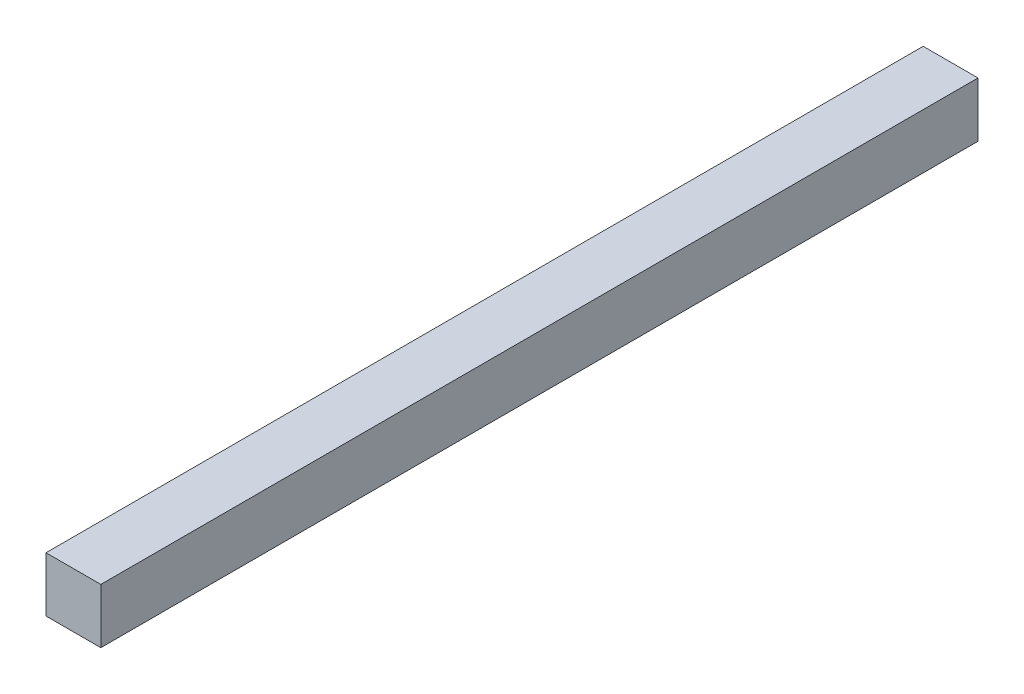
ISO-10303-21;
HEADER;
FILE_DESCRIPTION(('STEP AP214'),'2;1');
FILE_NAME('part.step','',(''),(''),'','','');
FILE_SCHEMA(('AUTOMOTIVE_DESIGN { 1 0 10303 214 1 1 1 1 }'));
ENDSEC;
DATA;
#1=APPLICATION_CONTEXT('core data for automotive mechanical design processes');
#2=APPLICATION_PROTOCOL_DEFINITION('international standard','automotive_design',2000,#1);
#3=PRODUCT_CONTEXT('',#1,'mechanical');
#4=PRODUCT('Part','Part','',(#3));
#5=PRODUCT_RELATED_PRODUCT_CATEGORY('part','',(#4));
#6=PRODUCT_DEFINITION_FORMATION('','',#4);
#7=PRODUCT_DEFINITION_CONTEXT('part definition',#1,'design');
#8=PRODUCT_DEFINITION('design','',#6,#7);
#9=PRODUCT_DEFINITION_SHAPE('','',#8);
#10=(LENGTH_UNIT() NAMED_UNIT(*) SI_UNIT(.MILLI.,.METRE.));
#11=(NAMED_UNIT(*) PLANE_ANGLE_UNIT() SI_UNIT($,.RADIAN.));
#12=(NAMED_UNIT(*) SI_UNIT($,.STERADIAN.) SOLID_ANGLE_UNIT());
#13=UNCERTAINTY_MEASURE_WITH_UNIT(LENGTH_MEASURE(1.E-05),#10,'distance_accuracy_value','');
#14=(GEOMETRIC_REPRESENTATION_CONTEXT(3) GLOBAL_UNCERTAINTY_ASSIGNED_CONTEXT((#13)) GLOBAL_UNIT_ASSIGNED_CONTEXT((#10,
#11,#12)) REPRESENTATION_CONTEXT('',''));
#15=CARTESIAN_POINT('',(0.,0.,0.));
#16=DIRECTION('',(0.,0.,1.));
#17=DIRECTION('',(1.,0.,0.));
#18=AXIS2_PLACEMENT_3D('',#15,#16,#17);
#19=CARTESIAN_POINT('',(-12.7,12.7,406.4));
#20=DIRECTION('',(1.,0.,0.));
#21=DIRECTION('',(0.,1.,0.));
#22=AXIS2_PLACEMENT_3D('',#19,#20,#21);
#23=PLANE('',#22);
#24=DIRECTION('',(0.,-1.,0.));
#25=VECTOR('',#24,1.);
#26=CARTESIAN_POINT('',(-12.7,12.7,0.));
#27=LINE('',#26,#25);
#28=CARTESIAN_POINT('',(-12.7,12.7,0.));
#29=VERTEX_POINT('',#28);
#30=CARTESIAN_POINT('',(-12.7,-12.7,0.));
#31=VERTEX_POINT('',#30);
#32=EDGE_CURVE('E107',#29,#31,#27,.T.);
#33=ORIENTED_EDGE('',*,*,#32,.T.);
#34=DIRECTION('',(0.,0.,-1.));
#35=VECTOR('',#34,1.);
#36=CARTESIAN_POINT('',(-12.7,-12.7,406.4));
#37=LINE('',#36,#35);
#38=CARTESIAN_POINT('',(-12.7,-12.7,406.4));
#39=VERTEX_POINT('',#38);
#40=EDGE_CURVE('E11',#39,#31,#37,.T.);
#41=ORIENTED_EDGE('',*,*,#40,.F.);
#42=DIRECTION('',(0.,-1.,0.));
#43=VECTOR('',#42,1.);
#44=CARTESIAN_POINT('',(-12.7,12.7,406.4));
#45=LINE('',#44,#43);
#46=CARTESIAN_POINT('',(-12.7,12.7,406.4));
#47=VERTEX_POINT('',#46);
#48=EDGE_CURVE('E89',#47,#39,#45,.T.);
#49=ORIENTED_EDGE('',*,*,#48,.F.);
#50=DIRECTION('',(0.,0.,-1.));
#51=VECTOR('',#50,1.);
#52=CARTESIAN_POINT('',(-12.7,12.7,406.4));
#53=LINE('',#52,#51);
#54=EDGE_CURVE('E56',#47,#29,#53,.T.);
#55=ORIENTED_EDGE('',*,*,#54,.T.);
#56=EDGE_LOOP('',(#33,#41,#49,#55));
#57=FACE_BOUND('',#56,.T.);
#58=ADVANCED_FACE('F39',(#57),#23,.F.);
#59=CARTESIAN_POINT('',(-12.7,-12.7,406.4));
#60=DIRECTION('',(0.,1.,0.));
#61=DIRECTION('',(0.,0.,1.));
#62=AXIS2_PLACEMENT_3D('',#59,#60,#61);
#63=PLANE('',#62);
#64=DIRECTION('',(1.,0.,0.));
#65=VECTOR('',#64,1.);
#66=CARTESIAN_POINT('',(-12.7,-12.7,0.));
#67=LINE('',#66,#65);
#68=CARTESIAN_POINT('',(12.7,-12.7,0.));
#69=VERTEX_POINT('',#68);
#70=EDGE_CURVE('E95',#31,#69,#67,.T.);
#71=ORIENTED_EDGE('',*,*,#70,.T.);
#72=DIRECTION('',(0.,0.,-1.));
#73=VECTOR('',#72,1.);
#74=CARTESIAN_POINT('',(12.7,-12.7,406.4));
#75=LINE('',#74,#73);
#76=CARTESIAN_POINT('',(12.7,-12.7,406.4));
#77=VERTEX_POINT('',#76);
#78=EDGE_CURVE('E48',#77,#69,#75,.T.);
#79=ORIENTED_EDGE('',*,*,#78,.F.);
#80=DIRECTION('',(1.,0.,0.));
#81=VECTOR('',#80,1.);
#82=CARTESIAN_POINT('',(-12.7,-12.7,406.4));
#83=LINE('',#82,#81);
#84=EDGE_CURVE('E81',#39,#77,#83,.T.);
#85=ORIENTED_EDGE('',*,*,#84,.F.);
#86=ORIENTED_EDGE('',*,*,#40,.T.);
#87=EDGE_LOOP('',(#71,#79,#85,#86));
#88=FACE_BOUND('',#87,.T.);
#89=ADVANCED_FACE('F94',(#88),#63,.F.);
#90=CARTESIAN_POINT('',(12.7,12.7,406.4));
#91=DIRECTION('',(1.,0.,0.));
#92=DIRECTION('',(0.,1.,0.));
#93=AXIS2_PLACEMENT_3D('',#90,#91,#92);
#94=PLANE('',#93);
#95=DIRECTION('',(0.,-1.,0.));
#96=VECTOR('',#95,1.);
#97=CARTESIAN_POINT('',(12.7,12.7,0.));
#98=LINE('',#97,#96);
#99=CARTESIAN_POINT('',(12.7,12.7,0.));
#100=VERTEX_POINT('',#99);
#101=EDGE_CURVE('E112',#100,#69,#98,.T.);
#102=ORIENTED_EDGE('',*,*,#101,.F.);
#103=DIRECTION('',(0.,0.,-1.));
#104=VECTOR('',#103,1.);
#105=CARTESIAN_POINT('',(12.7,12.7,406.4));
#106=LINE('',#105,#104);
#107=CARTESIAN_POINT('',(12.7,12.7,406.4));
#108=VERTEX_POINT('',#107);
#109=EDGE_CURVE('E70',#108,#100,#106,.T.);
#110=ORIENTED_EDGE('',*,*,#109,.F.);
#111=DIRECTION('',(0.,-1.,0.));
#112=VECTOR('',#111,1.);
#113=CARTESIAN_POINT('',(12.7,12.7,406.4));
#114=LINE('',#113,#112);
#115=EDGE_CURVE('E88',#108,#77,#114,.T.);
#116=ORIENTED_EDGE('',*,*,#115,.T.);
#117=ORIENTED_EDGE('',*,*,#78,.T.);
#118=EDGE_LOOP('',(#102,#110,#116,#117));
#119=FACE_BOUND('',#118,.T.);
#120=ADVANCED_FACE('F99',(#119),#94,.T.);
#121=CARTESIAN_POINT('',(-12.7,12.7,406.4));
#122=DIRECTION('',(0.,1.,0.));
#123=DIRECTION('',(0.,0.,1.));
#124=AXIS2_PLACEMENT_3D('',#121,#122,#123);
#125=PLANE('',#124);
#126=DIRECTION('',(1.,0.,0.));
#127=VECTOR('',#126,1.);
#128=CARTESIAN_POINT('',(-12.7,12.7,0.));
#129=LINE('',#128,#127);
#130=EDGE_CURVE('E115',#29,#100,#129,.T.);
#131=ORIENTED_EDGE('',*,*,#130,.F.);
#132=ORIENTED_EDGE('',*,*,#54,.F.);
#133=DIRECTION('',(1.,0.,0.));
#134=VECTOR('',#133,1.);
#135=CARTESIAN_POINT('',(-12.7,12.7,406.4));
#136=LINE('',#135,#134);
#137=EDGE_CURVE('E101',#47,#108,#136,.T.);
#138=ORIENTED_EDGE('',*,*,#137,.T.);
#139=ORIENTED_EDGE('',*,*,#109,.T.);
#140=EDGE_LOOP('',(#131,#132,#138,#139));
#141=FACE_BOUND('',#140,.T.);
#142=ADVANCED_FACE('F125',(#141),#125,.T.);
#143=CARTESIAN_POINT('',(0.,0.,406.4));
#144=DIRECTION('',(0.,0.,1.));
#145=DIRECTION('',(1.,0.,0.));
#146=AXIS2_PLACEMENT_3D('',#143,#144,#145);
#147=PLANE('',#146);
#148=ORIENTED_EDGE('',*,*,#48,.T.);
#149=ORIENTED_EDGE('',*,*,#84,.T.);
#150=ORIENTED_EDGE('',*,*,#115,.F.);
#151=ORIENTED_EDGE('',*,*,#137,.F.);
#152=EDGE_LOOP('',(#148,#149,#150,#151));
#153=FACE_BOUND('',#152,.T.);
#154=ADVANCED_FACE('F85',(#153),#147,.T.);
#155=CARTESIAN_POINT('',(0.,0.,0.));
#156=DIRECTION('',(0.,0.,1.));
#157=DIRECTION('',(1.,0.,0.));
#158=AXIS2_PLACEMENT_3D('',#155,#156,#157);
#159=PLANE('',#158);
#160=ORIENTED_EDGE('',*,*,#32,.F.);
#161=ORIENTED_EDGE('',*,*,#130,.T.);
#162=ORIENTED_EDGE('',*,*,#101,.T.);
#163=ORIENTED_EDGE('',*,*,#70,.F.);
#164=EDGE_LOOP('',(#160,#161,#162,#163));
#165=FACE_BOUND('',#164,.T.);
#166=ADVANCED_FACE('F124',(#165),#159,.F.);
#167=CLOSED_SHELL('',(#58,#89,#120,#142,#154,#166));
#168=MANIFOLD_SOLID_BREP('B2',#167);
#169=ADVANCED_BREP_SHAPE_REPRESENTATION('',(#18,#168),#14);
#170=SHAPE_DEFINITION_REPRESENTATION(#9,#169);
ENDSEC;
END-ISO-10303-21;
